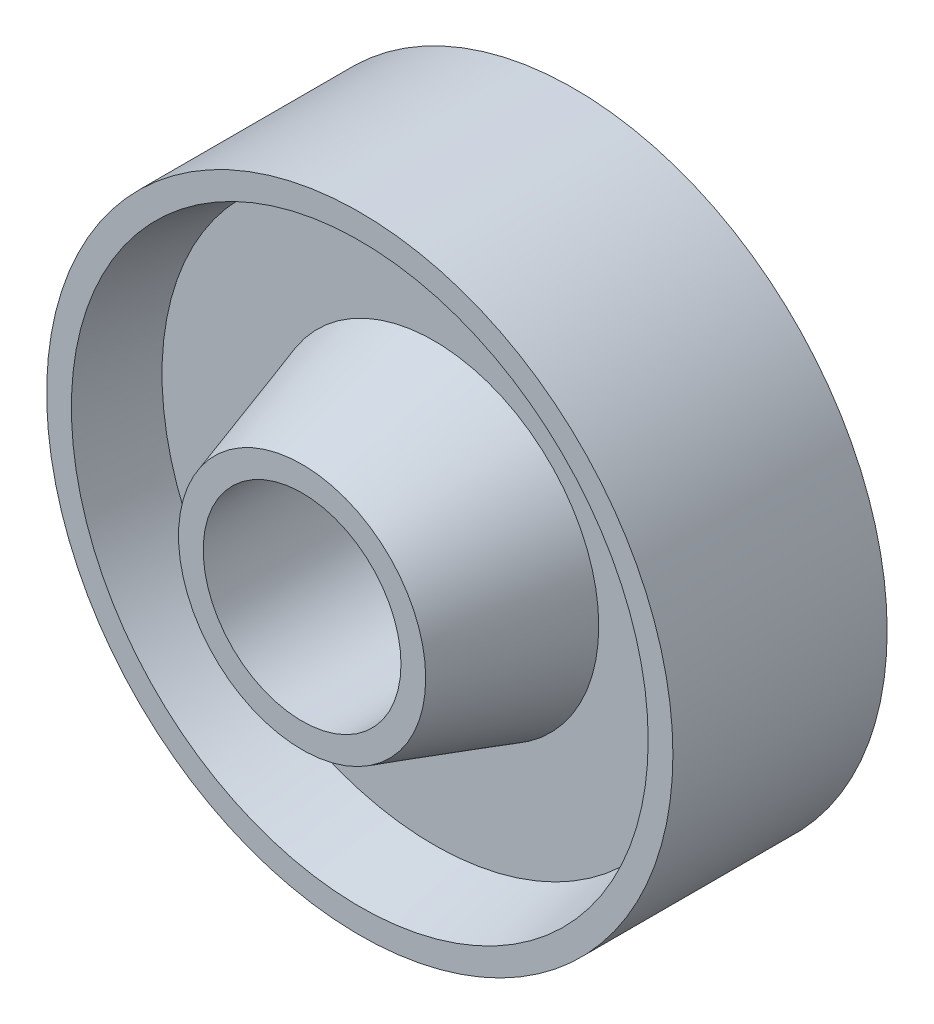
ISO-10303-21;
HEADER;
FILE_DESCRIPTION(('STEP AP214'),'2;1');
FILE_NAME('part.step','',(''),(''),'','','');
FILE_SCHEMA(('AUTOMOTIVE_DESIGN { 1 0 10303 214 1 1 1 1 }'));
ENDSEC;
DATA;
#1=APPLICATION_CONTEXT('core data for automotive mechanical design processes');
#2=APPLICATION_PROTOCOL_DEFINITION('international standard','automotive_design',2000,#1);
#3=PRODUCT_CONTEXT('',#1,'mechanical');
#4=PRODUCT('Part','Part','',(#3));
#5=PRODUCT_RELATED_PRODUCT_CATEGORY('part','',(#4));
#6=PRODUCT_DEFINITION_FORMATION('','',#4);
#7=PRODUCT_DEFINITION_CONTEXT('part definition',#1,'design');
#8=PRODUCT_DEFINITION('design','',#6,#7);
#9=PRODUCT_DEFINITION_SHAPE('','',#8);
#10=(LENGTH_UNIT() NAMED_UNIT(*) SI_UNIT(.MILLI.,.METRE.));
#11=(NAMED_UNIT(*) PLANE_ANGLE_UNIT() SI_UNIT($,.RADIAN.));
#12=(NAMED_UNIT(*) SI_UNIT($,.STERADIAN.) SOLID_ANGLE_UNIT());
#13=UNCERTAINTY_MEASURE_WITH_UNIT(LENGTH_MEASURE(1.E-05),#10,'distance_accuracy_value','');
#14=(GEOMETRIC_REPRESENTATION_CONTEXT(3) GLOBAL_UNCERTAINTY_ASSIGNED_CONTEXT((#13)) GLOBAL_UNIT_ASSIGNED_CONTEXT((#10,
#11,#12)) REPRESENTATION_CONTEXT('',''));
#15=CARTESIAN_POINT('',(0.,0.,0.));
#16=DIRECTION('',(0.,0.,1.));
#17=DIRECTION('',(1.,0.,0.));
#18=AXIS2_PLACEMENT_3D('',#15,#16,#17);
#19=CARTESIAN_POINT('',(0.,0.,0.));
#20=DIRECTION('',(0.,0.,1.));
#21=DIRECTION('',(1.,0.,0.));
#22=AXIS2_PLACEMENT_3D('',#19,#20,#21);
#23=CYLINDRICAL_SURFACE('',#22,38.);
#24=CARTESIAN_POINT('',(0.,0.,13.));
#25=DIRECTION('',(0.,0.,1.));
#26=DIRECTION('',(1.,0.,0.));
#27=AXIS2_PLACEMENT_3D('',#24,#25,#26);
#28=CIRCLE('',#27,38.);
#29=CARTESIAN_POINT('',(38.,0.,13.));
#30=VERTEX_POINT('',#29);
#31=EDGE_CURVE('E94',#30,#30,#28,.T.);
#32=ORIENTED_EDGE('',*,*,#31,.F.);
#33=EDGE_LOOP('',(#32));
#34=FACE_BOUND('',#33,.T.);
#35=CARTESIAN_POINT('',(0.,0.,-13.));
#36=DIRECTION('',(0.,0.,1.));
#37=DIRECTION('',(1.,0.,0.));
#38=AXIS2_PLACEMENT_3D('',#35,#36,#37);
#39=CIRCLE('',#38,38.);
#40=CARTESIAN_POINT('',(38.,0.,-13.));
#41=VERTEX_POINT('',#40);
#42=EDGE_CURVE('E10',#41,#41,#39,.T.);
#43=ORIENTED_EDGE('',*,*,#42,.T.);
#44=EDGE_LOOP('',(#43));
#45=FACE_BOUND('',#44,.T.);
#46=ADVANCED_FACE('F43',(#34,#45),#23,.T.);
#47=CARTESIAN_POINT('',(0.,38.,-13.));
#48=DIRECTION('',(0.,0.,1.));
#49=DIRECTION('',(1.,0.,0.));
#50=AXIS2_PLACEMENT_3D('',#47,#48,#49);
#51=PLANE('',#50);
#52=ORIENTED_EDGE('',*,*,#42,.F.);
#53=EDGE_LOOP('',(#52));
#54=FACE_BOUND('',#53,.T.);
#55=CARTESIAN_POINT('',(0.,0.,-13.));
#56=DIRECTION('',(0.,0.,1.));
#57=DIRECTION('',(1.,0.,0.));
#58=AXIS2_PLACEMENT_3D('',#55,#56,#57);
#59=CIRCLE('',#58,35.);
#60=CARTESIAN_POINT('',(35.,0.,-13.));
#61=VERTEX_POINT('',#60);
#62=EDGE_CURVE('E50',#61,#61,#59,.T.);
#63=ORIENTED_EDGE('',*,*,#62,.T.);
#64=EDGE_LOOP('',(#63));
#65=FACE_BOUND('',#64,.T.);
#66=ADVANCED_FACE('F102',(#54,#65),#51,.F.);
#67=CARTESIAN_POINT('',(0.,0.,-4.));
#68=DIRECTION('',(0.,0.,-1.));
#69=DIRECTION('',(-1.,0.,0.));
#70=AXIS2_PLACEMENT_3D('',#67,#68,#69);
#71=CONICAL_SURFACE('',#70,33.,0.218668945873942);
#72=ORIENTED_EDGE('',*,*,#62,.F.);
#73=EDGE_LOOP('',(#72));
#74=FACE_BOUND('',#73,.T.);
#75=CARTESIAN_POINT('',(0.,0.,-4.));
#76=DIRECTION('',(0.,0.,1.));
#77=DIRECTION('',(1.,0.,0.));
#78=AXIS2_PLACEMENT_3D('',#75,#76,#77);
#79=CIRCLE('',#78,33.);
#80=CARTESIAN_POINT('',(33.,0.,-4.));
#81=VERTEX_POINT('',#80);
#82=EDGE_CURVE('E55',#81,#81,#79,.T.);
#83=ORIENTED_EDGE('',*,*,#82,.T.);
#84=EDGE_LOOP('',(#83));
#85=FACE_BOUND('',#84,.T.);
#86=ADVANCED_FACE('F106',(#74,#85),#71,.F.);
#87=CARTESIAN_POINT('',(0.,33.,-4.));
#88=DIRECTION('',(0.,0.,1.));
#89=DIRECTION('',(1.,0.,0.));
#90=AXIS2_PLACEMENT_3D('',#87,#88,#89);
#91=PLANE('',#90);
#92=ORIENTED_EDGE('',*,*,#82,.F.);
#93=EDGE_LOOP('',(#92));
#94=FACE_BOUND('',#93,.T.);
#95=CARTESIAN_POINT('',(0.,0.,-4.));
#96=DIRECTION('',(0.,0.,1.));
#97=DIRECTION('',(1.,0.,0.));
#98=AXIS2_PLACEMENT_3D('',#95,#96,#97);
#99=CIRCLE('',#98,20.);
#100=CARTESIAN_POINT('',(20.,0.,-4.));
#101=VERTEX_POINT('',#100);
#102=EDGE_CURVE('E60',#101,#101,#99,.T.);
#103=ORIENTED_EDGE('',*,*,#102,.T.);
#104=EDGE_LOOP('',(#103));
#105=FACE_BOUND('',#104,.T.);
#106=ADVANCED_FACE('F111',(#94,#105),#91,.F.);
#107=CARTESIAN_POINT('',(0.,0.,-20.));
#108=DIRECTION('',(0.,0.,1.));
#109=DIRECTION('',(1.,0.,0.));
#110=AXIS2_PLACEMENT_3D('',#107,#108,#109);
#111=CONICAL_SURFACE('',#110,15.,0.302884868374971);
#112=ORIENTED_EDGE('',*,*,#102,.F.);
#113=EDGE_LOOP('',(#112));
#114=FACE_BOUND('',#113,.T.);
#115=CARTESIAN_POINT('',(0.,0.,-20.));
#116=DIRECTION('',(0.,0.,1.));
#117=DIRECTION('',(1.,0.,0.));
#118=AXIS2_PLACEMENT_3D('',#115,#116,#117);
#119=CIRCLE('',#118,15.);
#120=CARTESIAN_POINT('',(15.,0.,-20.));
#121=VERTEX_POINT('',#120);
#122=EDGE_CURVE('E66',#121,#121,#119,.T.);
#123=ORIENTED_EDGE('',*,*,#122,.T.);
#124=EDGE_LOOP('',(#123));
#125=FACE_BOUND('',#124,.T.);
#126=ADVANCED_FACE('F117',(#114,#125),#111,.T.);
#127=CARTESIAN_POINT('',(0.,15.,-20.));
#128=DIRECTION('',(0.,0.,1.));
#129=DIRECTION('',(1.,0.,0.));
#130=AXIS2_PLACEMENT_3D('',#127,#128,#129);
#131=PLANE('',#130);
#132=ORIENTED_EDGE('',*,*,#122,.F.);
#133=EDGE_LOOP('',(#132));
#134=FACE_BOUND('',#133,.T.);
#135=CARTESIAN_POINT('',(0.,0.,-20.));
#136=DIRECTION('',(0.,0.,1.));
#137=DIRECTION('',(1.,0.,0.));
#138=AXIS2_PLACEMENT_3D('',#135,#136,#137);
#139=CIRCLE('',#138,12.);
#140=CARTESIAN_POINT('',(12.,0.,-20.));
#141=VERTEX_POINT('',#140);
#142=EDGE_CURVE('E70',#141,#141,#139,.T.);
#143=ORIENTED_EDGE('',*,*,#142,.T.);
#144=EDGE_LOOP('',(#143));
#145=FACE_BOUND('',#144,.T.);
#146=ADVANCED_FACE('F121',(#134,#145),#131,.F.);
#147=CARTESIAN_POINT('',(0.,0.,0.));
#148=DIRECTION('',(0.,0.,1.));
#149=DIRECTION('',(1.,0.,0.));
#150=AXIS2_PLACEMENT_3D('',#147,#148,#149);
#151=CYLINDRICAL_SURFACE('',#150,12.);
#152=ORIENTED_EDGE('',*,*,#142,.F.);
#153=EDGE_LOOP('',(#152));
#154=FACE_BOUND('',#153,.T.);
#155=CARTESIAN_POINT('',(0.,0.,20.));
#156=DIRECTION('',(0.,0.,1.));
#157=DIRECTION('',(1.,0.,0.));
#158=AXIS2_PLACEMENT_3D('',#155,#156,#157);
#159=CIRCLE('',#158,12.);
#160=CARTESIAN_POINT('',(12.,0.,20.));
#161=VERTEX_POINT('',#160);
#162=EDGE_CURVE('E74',#161,#161,#159,.T.);
#163=ORIENTED_EDGE('',*,*,#162,.T.);
#164=EDGE_LOOP('',(#163));
#165=FACE_BOUND('',#164,.T.);
#166=ADVANCED_FACE('F125',(#154,#165),#151,.F.);
#167=CARTESIAN_POINT('',(0.,15.,20.));
#168=DIRECTION('',(0.,0.,-1.));
#169=DIRECTION('',(-1.,0.,0.));
#170=AXIS2_PLACEMENT_3D('',#167,#168,#169);
#171=PLANE('',#170);
#172=ORIENTED_EDGE('',*,*,#162,.F.);
#173=EDGE_LOOP('',(#172));
#174=FACE_BOUND('',#173,.T.);
#175=CARTESIAN_POINT('',(0.,0.,20.));
#176=DIRECTION('',(0.,0.,1.));
#177=DIRECTION('',(1.,0.,0.));
#178=AXIS2_PLACEMENT_3D('',#175,#176,#177);
#179=CIRCLE('',#178,15.);
#180=CARTESIAN_POINT('',(15.,0.,20.));
#181=VERTEX_POINT('',#180);
#182=EDGE_CURVE('E78',#181,#181,#179,.T.);
#183=ORIENTED_EDGE('',*,*,#182,.T.);
#184=EDGE_LOOP('',(#183));
#185=FACE_BOUND('',#184,.T.);
#186=ADVANCED_FACE('F129',(#174,#185),#171,.F.);
#187=CARTESIAN_POINT('',(0.,0.,4.));
#188=DIRECTION('',(0.,0.,-1.));
#189=DIRECTION('',(-1.,0.,0.));
#190=AXIS2_PLACEMENT_3D('',#187,#188,#189);
#191=CONICAL_SURFACE('',#190,20.,0.302884868374971);
#192=ORIENTED_EDGE('',*,*,#182,.F.);
#193=EDGE_LOOP('',(#192));
#194=FACE_BOUND('',#193,.T.);
#195=CARTESIAN_POINT('',(0.,0.,4.));
#196=DIRECTION('',(0.,0.,1.));
#197=DIRECTION('',(1.,0.,0.));
#198=AXIS2_PLACEMENT_3D('',#195,#196,#197);
#199=CIRCLE('',#198,20.);
#200=CARTESIAN_POINT('',(20.,0.,4.));
#201=VERTEX_POINT('',#200);
#202=EDGE_CURVE('E82',#201,#201,#199,.T.);
#203=ORIENTED_EDGE('',*,*,#202,.T.);
#204=EDGE_LOOP('',(#203));
#205=FACE_BOUND('',#204,.T.);
#206=ADVANCED_FACE('F133',(#194,#205),#191,.T.);
#207=CARTESIAN_POINT('',(0.,33.,4.));
#208=DIRECTION('',(0.,0.,-1.));
#209=DIRECTION('',(-1.,0.,0.));
#210=AXIS2_PLACEMENT_3D('',#207,#208,#209);
#211=PLANE('',#210);
#212=ORIENTED_EDGE('',*,*,#202,.F.);
#213=EDGE_LOOP('',(#212));
#214=FACE_BOUND('',#213,.T.);
#215=CARTESIAN_POINT('',(0.,0.,4.));
#216=DIRECTION('',(0.,0.,1.));
#217=DIRECTION('',(1.,0.,0.));
#218=AXIS2_PLACEMENT_3D('',#215,#216,#217);
#219=CIRCLE('',#218,33.);
#220=CARTESIAN_POINT('',(33.,0.,4.));
#221=VERTEX_POINT('',#220);
#222=EDGE_CURVE('E86',#221,#221,#219,.T.);
#223=ORIENTED_EDGE('',*,*,#222,.T.);
#224=EDGE_LOOP('',(#223));
#225=FACE_BOUND('',#224,.T.);
#226=ADVANCED_FACE('F137',(#214,#225),#211,.F.);
#227=CARTESIAN_POINT('',(0.,0.,13.));
#228=DIRECTION('',(0.,0.,1.));
#229=DIRECTION('',(1.,0.,0.));
#230=AXIS2_PLACEMENT_3D('',#227,#228,#229);
#231=CONICAL_SURFACE('',#230,35.,0.218668945873942);
#232=ORIENTED_EDGE('',*,*,#222,.F.);
#233=EDGE_LOOP('',(#232));
#234=FACE_BOUND('',#233,.T.);
#235=CARTESIAN_POINT('',(0.,0.,13.));
#236=DIRECTION('',(0.,0.,1.));
#237=DIRECTION('',(1.,0.,0.));
#238=AXIS2_PLACEMENT_3D('',#235,#236,#237);
#239=CIRCLE('',#238,35.);
#240=CARTESIAN_POINT('',(35.,0.,13.));
#241=VERTEX_POINT('',#240);
#242=EDGE_CURVE('E90',#241,#241,#239,.T.);
#243=ORIENTED_EDGE('',*,*,#242,.T.);
#244=EDGE_LOOP('',(#243));
#245=FACE_BOUND('',#244,.T.);
#246=ADVANCED_FACE('F141',(#234,#245),#231,.F.);
#247=CARTESIAN_POINT('',(0.,38.,13.));
#248=DIRECTION('',(0.,0.,-1.));
#249=DIRECTION('',(-1.,0.,0.));
#250=AXIS2_PLACEMENT_3D('',#247,#248,#249);
#251=PLANE('',#250);
#252=ORIENTED_EDGE('',*,*,#242,.F.);
#253=EDGE_LOOP('',(#252));
#254=FACE_BOUND('',#253,.T.);
#255=ORIENTED_EDGE('',*,*,#31,.T.);
#256=EDGE_LOOP('',(#255));
#257=FACE_BOUND('',#256,.T.);
#258=ADVANCED_FACE('F99',(#254,#257),#251,.F.);
#259=CLOSED_SHELL('',(#46,#66,#86,#106,#126,#146,#166,#186,#206,#226,#246,#258));
#260=MANIFOLD_SOLID_BREP('B2',#259);
#261=ADVANCED_BREP_SHAPE_REPRESENTATION('',(#18,#260),#14);
#262=SHAPE_DEFINITION_REPRESENTATION(#9,#261);
ENDSEC;
END-ISO-10303-21;
